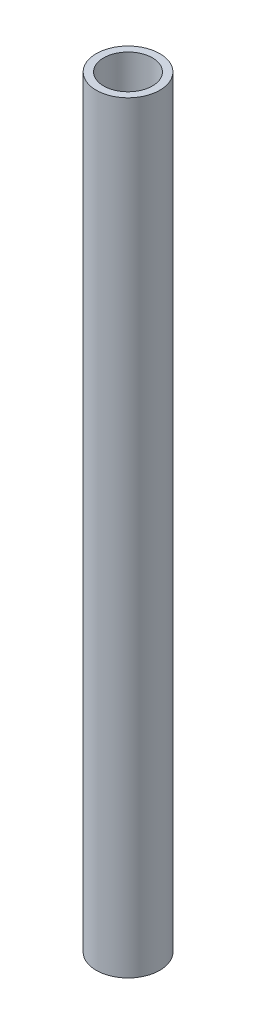
ISO-10303-21;
HEADER;
FILE_DESCRIPTION(('STEP AP214'),'2;1');
FILE_NAME('part.step','',(''),(''),'','','');
FILE_SCHEMA(('AUTOMOTIVE_DESIGN { 1 0 10303 214 1 1 1 1 }'));
ENDSEC;
DATA;
#1=APPLICATION_CONTEXT('core data for automotive mechanical design processes');
#2=APPLICATION_PROTOCOL_DEFINITION('international standard','automotive_design',2000,#1);
#3=PRODUCT_CONTEXT('',#1,'mechanical');
#4=PRODUCT('Part','Part','',(#3));
#5=PRODUCT_RELATED_PRODUCT_CATEGORY('part','',(#4));
#6=PRODUCT_DEFINITION_FORMATION('','',#4);
#7=PRODUCT_DEFINITION_CONTEXT('part definition',#1,'design');
#8=PRODUCT_DEFINITION('design','',#6,#7);
#9=PRODUCT_DEFINITION_SHAPE('','',#8);
#10=(LENGTH_UNIT() NAMED_UNIT(*) SI_UNIT(.MILLI.,.METRE.));
#11=(NAMED_UNIT(*) PLANE_ANGLE_UNIT() SI_UNIT($,.RADIAN.));
#12=(NAMED_UNIT(*) SI_UNIT($,.STERADIAN.) SOLID_ANGLE_UNIT());
#13=UNCERTAINTY_MEASURE_WITH_UNIT(LENGTH_MEASURE(1.E-05),#10,'distance_accuracy_value','');
#14=(GEOMETRIC_REPRESENTATION_CONTEXT(3) GLOBAL_UNCERTAINTY_ASSIGNED_CONTEXT((#13)) GLOBAL_UNIT_ASSIGNED_CONTEXT((#10,
#11,#12)) REPRESENTATION_CONTEXT('',''));
#15=CARTESIAN_POINT('',(0.,0.,0.));
#16=DIRECTION('',(0.,0.,1.));
#17=DIRECTION('',(1.,0.,0.));
#18=AXIS2_PLACEMENT_3D('',#15,#16,#17);
#19=CARTESIAN_POINT('',(0.,152.4,0.));
#20=DIRECTION('',(0.,1.,0.));
#21=DIRECTION('',(0.,0.,1.));
#22=AXIS2_PLACEMENT_3D('',#19,#20,#21);
#23=PLANE('',#22);
#24=CARTESIAN_POINT('',(0.,152.4,0.));
#25=DIRECTION('',(0.,1.,0.));
#26=DIRECTION('',(0.,0.,1.));
#27=AXIS2_PLACEMENT_3D('',#24,#25,#26);
#28=CIRCLE('',#27,6.35);
#29=CARTESIAN_POINT('',(0.,152.4,-6.35));
#30=VERTEX_POINT('',#29);
#31=EDGE_CURVE('E10',#30,#30,#28,.T.);
#32=ORIENTED_EDGE('',*,*,#31,.T.);
#33=EDGE_LOOP('',(#32));
#34=FACE_BOUND('',#33,.T.);
#35=CARTESIAN_POINT('',(0.,152.4,0.));
#36=DIRECTION('',(0.,1.,0.));
#37=DIRECTION('',(0.,0.,1.));
#38=AXIS2_PLACEMENT_3D('',#35,#36,#37);
#39=CIRCLE('',#38,4.8768);
#40=CARTESIAN_POINT('',(0.,152.4,-4.8768));
#41=VERTEX_POINT('',#40);
#42=EDGE_CURVE('E42',#41,#41,#39,.T.);
#43=ORIENTED_EDGE('',*,*,#42,.F.);
#44=EDGE_LOOP('',(#43));
#45=FACE_BOUND('',#44,.T.);
#46=ADVANCED_FACE('F31',(#34,#45),#23,.T.);
#47=CARTESIAN_POINT('',(0.,0.,0.));
#48=DIRECTION('',(0.,1.,0.));
#49=DIRECTION('',(0.,0.,1.));
#50=AXIS2_PLACEMENT_3D('',#47,#48,#49);
#51=PLANE('',#50);
#52=CARTESIAN_POINT('',(0.,0.,0.));
#53=DIRECTION('',(0.,1.,0.));
#54=DIRECTION('',(0.,0.,1.));
#55=AXIS2_PLACEMENT_3D('',#52,#53,#54);
#56=CIRCLE('',#55,6.35);
#57=CARTESIAN_POINT('',(0.,0.,-6.35));
#58=VERTEX_POINT('',#57);
#59=EDGE_CURVE('E35',#58,#58,#56,.T.);
#60=ORIENTED_EDGE('',*,*,#59,.F.);
#61=EDGE_LOOP('',(#60));
#62=FACE_BOUND('',#61,.T.);
#63=CARTESIAN_POINT('',(0.,0.,0.));
#64=DIRECTION('',(0.,1.,0.));
#65=DIRECTION('',(0.,0.,1.));
#66=AXIS2_PLACEMENT_3D('',#63,#64,#65);
#67=CIRCLE('',#66,4.8768);
#68=CARTESIAN_POINT('',(0.,0.,-4.8768));
#69=VERTEX_POINT('',#68);
#70=EDGE_CURVE('E44',#69,#69,#67,.T.);
#71=ORIENTED_EDGE('',*,*,#70,.T.);
#72=EDGE_LOOP('',(#71));
#73=FACE_BOUND('',#72,.T.);
#74=ADVANCED_FACE('F54',(#62,#73),#51,.F.);
#75=CARTESIAN_POINT('',(0.,152.4,0.));
#76=DIRECTION('',(0.,-1.,0.));
#77=DIRECTION('',(0.,0.,-1.));
#78=AXIS2_PLACEMENT_3D('',#75,#76,#77);
#79=CYLINDRICAL_SURFACE('',#78,6.35);
#80=CARTESIAN_POINT('',(0.,152.4,-6.35));
#81=CARTESIAN_POINT('',(0.,150.8125,-6.35));
#82=CARTESIAN_POINT('',(0.,149.225,-6.35));
#83=CARTESIAN_POINT('',(0.,146.05,-6.35));
#84=CARTESIAN_POINT('',(0.,144.4625,-6.35));
#85=CARTESIAN_POINT('',(0.,141.2875,-6.35));
#86=CARTESIAN_POINT('',(0.,139.7,-6.35));
#87=CARTESIAN_POINT('',(0.,136.525,-6.35));
#88=CARTESIAN_POINT('',(0.,134.9375,-6.35));
#89=CARTESIAN_POINT('',(0.,131.7625,-6.35));
#90=CARTESIAN_POINT('',(0.,130.175,-6.35));
#91=CARTESIAN_POINT('',(0.,127.,-6.35));
#92=CARTESIAN_POINT('',(0.,125.4125,-6.35));
#93=CARTESIAN_POINT('',(0.,122.2375,-6.35));
#94=CARTESIAN_POINT('',(0.,120.65,-6.35));
#95=CARTESIAN_POINT('',(0.,117.475,-6.35));
#96=CARTESIAN_POINT('',(0.,115.8875,-6.35));
#97=CARTESIAN_POINT('',(0.,112.7125,-6.35));
#98=CARTESIAN_POINT('',(0.,111.125,-6.35));
#99=CARTESIAN_POINT('',(0.,107.95,-6.35));
#100=CARTESIAN_POINT('',(0.,106.3625,-6.35));
#101=CARTESIAN_POINT('',(0.,103.1875,-6.35));
#102=CARTESIAN_POINT('',(0.,101.6,-6.35));
#103=CARTESIAN_POINT('',(0.,98.425,-6.35));
#104=CARTESIAN_POINT('',(0.,96.8375,-6.35));
#105=CARTESIAN_POINT('',(0.,93.6625,-6.35));
#106=CARTESIAN_POINT('',(0.,92.075,-6.35));
#107=CARTESIAN_POINT('',(0.,88.9,-6.35));
#108=CARTESIAN_POINT('',(0.,87.3125,-6.35));
#109=CARTESIAN_POINT('',(0.,84.1375,-6.35));
#110=CARTESIAN_POINT('',(0.,82.55,-6.35));
#111=CARTESIAN_POINT('',(0.,79.375,-6.35));
#112=CARTESIAN_POINT('',(0.,77.7875,-6.35));
#113=CARTESIAN_POINT('',(0.,74.6125,-6.35));
#114=CARTESIAN_POINT('',(0.,73.025,-6.35));
#115=CARTESIAN_POINT('',(0.,69.85,-6.35));
#116=CARTESIAN_POINT('',(0.,68.2625,-6.35));
#117=CARTESIAN_POINT('',(0.,65.0875,-6.35));
#118=CARTESIAN_POINT('',(0.,63.5,-6.35));
#119=CARTESIAN_POINT('',(0.,60.325,-6.35));
#120=CARTESIAN_POINT('',(0.,58.7375,-6.35));
#121=CARTESIAN_POINT('',(0.,55.5625,-6.35));
#122=CARTESIAN_POINT('',(0.,53.975,-6.35));
#123=CARTESIAN_POINT('',(0.,50.8,-6.35));
#124=CARTESIAN_POINT('',(0.,49.2125,-6.35));
#125=CARTESIAN_POINT('',(0.,46.0375,-6.35));
#126=CARTESIAN_POINT('',(0.,44.45,-6.35));
#127=CARTESIAN_POINT('',(0.,41.275,-6.35));
#128=CARTESIAN_POINT('',(0.,39.6875,-6.35));
#129=CARTESIAN_POINT('',(0.,36.5125,-6.35));
#130=CARTESIAN_POINT('',(0.,34.925,-6.35));
#131=CARTESIAN_POINT('',(0.,31.75,-6.35));
#132=CARTESIAN_POINT('',(0.,30.1625,-6.35));
#133=CARTESIAN_POINT('',(0.,26.9875,-6.35));
#134=CARTESIAN_POINT('',(0.,25.4,-6.35));
#135=CARTESIAN_POINT('',(0.,22.225,-6.35));
#136=CARTESIAN_POINT('',(0.,20.6375,-6.35));
#137=CARTESIAN_POINT('',(0.,17.4625,-6.35));
#138=CARTESIAN_POINT('',(0.,15.875,-6.35));
#139=CARTESIAN_POINT('',(0.,12.7,-6.35));
#140=CARTESIAN_POINT('',(0.,11.1125,-6.35));
#141=CARTESIAN_POINT('',(0.,7.93750000000001,-6.35));
#142=CARTESIAN_POINT('',(0.,6.35,-6.35));
#143=CARTESIAN_POINT('',(0.,3.175,-6.35));
#144=CARTESIAN_POINT('',(0.,1.5875,-6.35));
#145=CARTESIAN_POINT('',(0.,0.,-6.35));
#146=B_SPLINE_CURVE_WITH_KNOTS('',3,(#80,#81,#82,#83,#84,#85,#86,#87,#88,#89,#90,#91,#92,#93,
#94,#95,#96,#97,#98,#99,#100,#101,#102,#103,#104,#105,#106,#107,#108,#109,#110,#111,#112,#113,
#114,#115,#116,#117,#118,#119,#120,#121,#122,#123,#124,#125,#126,#127,#128,#129,#130,#131,#132,
#133,#134,#135,#136,#137,#138,#139,#140,#141,#142,#143,#144,#145),.UNSPECIFIED.,.F.,.F.,(4,2,2,
2,2,2,2,2,2,2,2,2,2,2,2,2,2,2,2,2,2,2,2,2,2,2,2,2,2,2,2,2,4),(0.,4.7625,9.52500000000001,
14.2875,19.05,23.8125,28.575,33.3375,38.1,42.8625,47.625,52.3875,57.15,61.9125,66.675,71.4375,
76.2,80.9625,85.725,90.4875,95.25,100.0125,104.775,109.5375,114.3,119.0625,123.825,128.5875,
133.35,138.1125,142.875,147.6375,152.4),.UNSPECIFIED.);
#147=EDGE_CURVE('BSEAM33',#30,#58,#146,.T.);
#148=ORIENTED_EDGE('',*,*,#31,.F.);
#149=ORIENTED_EDGE('',*,*,#59,.T.);
#150=ORIENTED_EDGE('',*,*,#147,.T.);
#151=ORIENTED_EDGE('',*,*,#147,.F.);
#152=EDGE_LOOP('',(#148,#150,#149,#151));
#153=FACE_BOUND('',#152,.T.);
#154=ADVANCED_FACE('F33',(#153),#79,.T.);
#155=CARTESIAN_POINT('',(0.,152.4,0.));
#156=DIRECTION('',(0.,-1.,0.));
#157=DIRECTION('',(0.,0.,-1.));
#158=AXIS2_PLACEMENT_3D('',#155,#156,#157);
#159=CYLINDRICAL_SURFACE('',#158,4.8768);
#160=CARTESIAN_POINT('',(0.,152.4,-4.8768));
#161=CARTESIAN_POINT('',(0.,150.8125,-4.8768));
#162=CARTESIAN_POINT('',(0.,149.225,-4.8768));
#163=CARTESIAN_POINT('',(0.,146.05,-4.8768));
#164=CARTESIAN_POINT('',(0.,144.4625,-4.8768));
#165=CARTESIAN_POINT('',(0.,141.2875,-4.8768));
#166=CARTESIAN_POINT('',(0.,139.7,-4.8768));
#167=CARTESIAN_POINT('',(0.,136.525,-4.8768));
#168=CARTESIAN_POINT('',(0.,134.9375,-4.8768));
#169=CARTESIAN_POINT('',(0.,131.7625,-4.8768));
#170=CARTESIAN_POINT('',(0.,130.175,-4.8768));
#171=CARTESIAN_POINT('',(0.,127.,-4.8768));
#172=CARTESIAN_POINT('',(0.,125.4125,-4.8768));
#173=CARTESIAN_POINT('',(0.,122.2375,-4.8768));
#174=CARTESIAN_POINT('',(0.,120.65,-4.8768));
#175=CARTESIAN_POINT('',(0.,117.475,-4.8768));
#176=CARTESIAN_POINT('',(0.,115.8875,-4.8768));
#177=CARTESIAN_POINT('',(0.,112.7125,-4.8768));
#178=CARTESIAN_POINT('',(0.,111.125,-4.8768));
#179=CARTESIAN_POINT('',(0.,107.95,-4.8768));
#180=CARTESIAN_POINT('',(0.,106.3625,-4.8768));
#181=CARTESIAN_POINT('',(0.,103.1875,-4.8768));
#182=CARTESIAN_POINT('',(0.,101.6,-4.8768));
#183=CARTESIAN_POINT('',(0.,98.425,-4.8768));
#184=CARTESIAN_POINT('',(0.,96.8375,-4.8768));
#185=CARTESIAN_POINT('',(0.,93.6625,-4.8768));
#186=CARTESIAN_POINT('',(0.,92.075,-4.8768));
#187=CARTESIAN_POINT('',(0.,88.9,-4.8768));
#188=CARTESIAN_POINT('',(0.,87.3125,-4.8768));
#189=CARTESIAN_POINT('',(0.,84.1375,-4.8768));
#190=CARTESIAN_POINT('',(0.,82.55,-4.8768));
#191=CARTESIAN_POINT('',(0.,79.375,-4.8768));
#192=CARTESIAN_POINT('',(0.,77.7875,-4.8768));
#193=CARTESIAN_POINT('',(0.,74.6125,-4.8768));
#194=CARTESIAN_POINT('',(0.,73.025,-4.8768));
#195=CARTESIAN_POINT('',(0.,69.85,-4.8768));
#196=CARTESIAN_POINT('',(0.,68.2625,-4.8768));
#197=CARTESIAN_POINT('',(0.,65.0875,-4.8768));
#198=CARTESIAN_POINT('',(0.,63.5,-4.8768));
#199=CARTESIAN_POINT('',(0.,60.325,-4.8768));
#200=CARTESIAN_POINT('',(0.,58.7375,-4.8768));
#201=CARTESIAN_POINT('',(0.,55.5625,-4.8768));
#202=CARTESIAN_POINT('',(0.,53.975,-4.8768));
#203=CARTESIAN_POINT('',(0.,50.8,-4.8768));
#204=CARTESIAN_POINT('',(0.,49.2125,-4.8768));
#205=CARTESIAN_POINT('',(0.,46.0375,-4.8768));
#206=CARTESIAN_POINT('',(0.,44.45,-4.8768));
#207=CARTESIAN_POINT('',(0.,41.275,-4.8768));
#208=CARTESIAN_POINT('',(0.,39.6875,-4.8768));
#209=CARTESIAN_POINT('',(0.,36.5125,-4.8768));
#210=CARTESIAN_POINT('',(0.,34.925,-4.8768));
#211=CARTESIAN_POINT('',(0.,31.75,-4.8768));
#212=CARTESIAN_POINT('',(0.,30.1625,-4.8768));
#213=CARTESIAN_POINT('',(0.,26.9875,-4.8768));
#214=CARTESIAN_POINT('',(0.,25.4,-4.8768));
#215=CARTESIAN_POINT('',(0.,22.225,-4.8768));
#216=CARTESIAN_POINT('',(0.,20.6375,-4.8768));
#217=CARTESIAN_POINT('',(0.,17.4625,-4.8768));
#218=CARTESIAN_POINT('',(0.,15.875,-4.8768));
#219=CARTESIAN_POINT('',(0.,12.7,-4.8768));
#220=CARTESIAN_POINT('',(0.,11.1125,-4.8768));
#221=CARTESIAN_POINT('',(0.,7.93750000000001,-4.8768));
#222=CARTESIAN_POINT('',(0.,6.35,-4.8768));
#223=CARTESIAN_POINT('',(0.,3.175,-4.8768));
#224=CARTESIAN_POINT('',(0.,1.5875,-4.8768));
#225=CARTESIAN_POINT('',(0.,0.,-4.8768));
#226=B_SPLINE_CURVE_WITH_KNOTS('',3,(#160,#161,#162,#163,#164,#165,#166,#167,#168,#169,#170,
#171,#172,#173,#174,#175,#176,#177,#178,#179,#180,#181,#182,#183,#184,#185,#186,#187,#188,#189,
#190,#191,#192,#193,#194,#195,#196,#197,#198,#199,#200,#201,#202,#203,#204,#205,#206,#207,#208,
#209,#210,#211,#212,#213,#214,#215,#216,#217,#218,#219,#220,#221,#222,#223,#224,#225),
.UNSPECIFIED.,.F.,.F.,(4,2,2,2,2,2,2,2,2,2,2,2,2,2,2,2,2,2,2,2,2,2,2,2,2,2,2,2,2,2,2,2,4),(0.,
4.7625,9.52500000000001,14.2875,19.05,23.8125,28.575,33.3375,38.1,42.8625,47.625,52.3875,57.15,
61.9125,66.675,71.4375,76.2,80.9625,85.725,90.4875,95.25,100.0125,104.775,109.5375,114.3,
119.0625,123.825,128.5875,133.35,138.1125,142.875,147.6375,152.4),.UNSPECIFIED.);
#227=EDGE_CURVE('BSEAM50',#41,#69,#226,.T.);
#228=ORIENTED_EDGE('',*,*,#42,.T.);
#229=ORIENTED_EDGE('',*,*,#70,.F.);
#230=ORIENTED_EDGE('',*,*,#227,.T.);
#231=ORIENTED_EDGE('',*,*,#227,.F.);
#232=EDGE_LOOP('',(#228,#230,#229,#231));
#233=FACE_BOUND('',#232,.T.);
#234=ADVANCED_FACE('F50',(#233),#159,.F.);
#235=CLOSED_SHELL('',(#46,#74,#154,#234));
#236=MANIFOLD_SOLID_BREP('B2',#235);
#237=ADVANCED_BREP_SHAPE_REPRESENTATION('',(#18,#236),#14);
#238=SHAPE_DEFINITION_REPRESENTATION(#9,#237);
ENDSEC;
END-ISO-10303-21;
